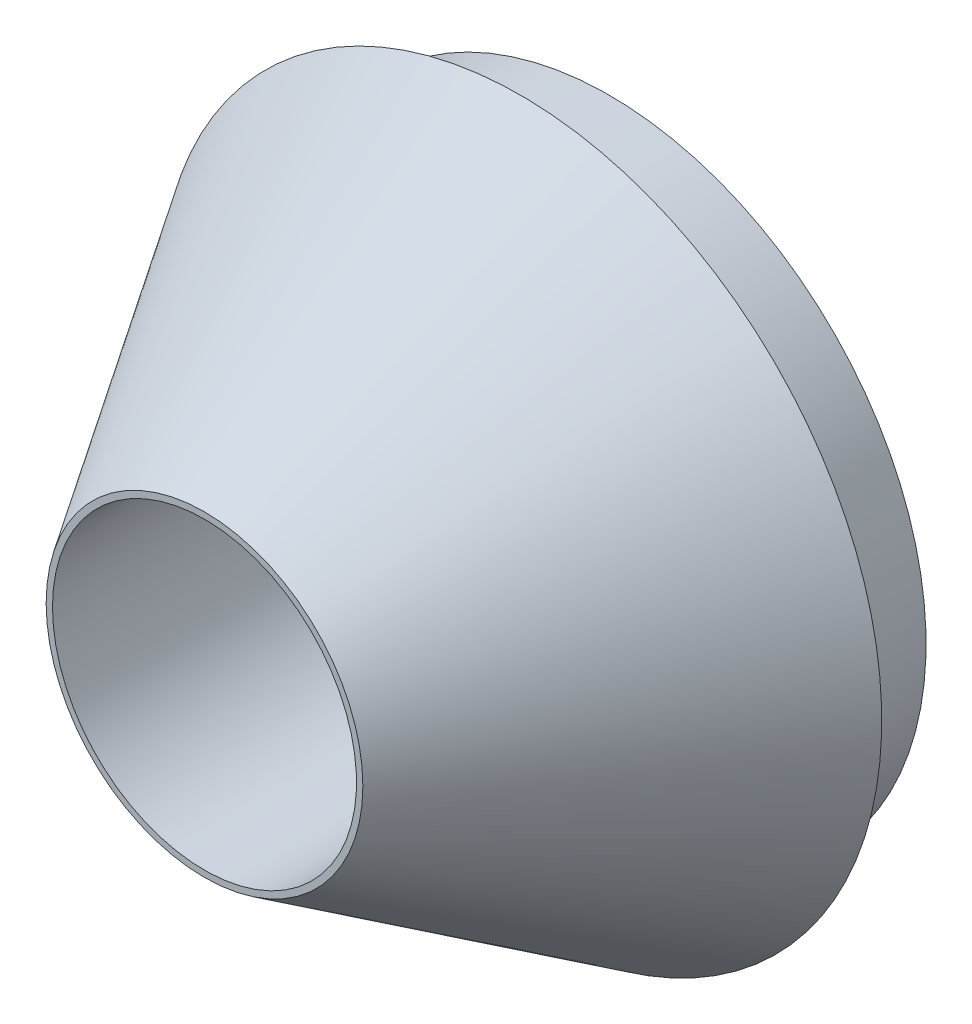
ISO-10303-21;
HEADER;
FILE_DESCRIPTION(('STEP AP214'),'2;1');
FILE_NAME('part.step','',(''),(''),'','','');
FILE_SCHEMA(('AUTOMOTIVE_DESIGN { 1 0 10303 214 1 1 1 1 }'));
ENDSEC;
DATA;
#1=APPLICATION_CONTEXT('core data for automotive mechanical design processes');
#2=APPLICATION_PROTOCOL_DEFINITION('international standard','automotive_design',2000,#1);
#3=PRODUCT_CONTEXT('',#1,'mechanical');
#4=PRODUCT('Part','Part','',(#3));
#5=PRODUCT_RELATED_PRODUCT_CATEGORY('part','',(#4));
#6=PRODUCT_DEFINITION_FORMATION('','',#4);
#7=PRODUCT_DEFINITION_CONTEXT('part definition',#1,'design');
#8=PRODUCT_DEFINITION('design','',#6,#7);
#9=PRODUCT_DEFINITION_SHAPE('','',#8);
#10=(LENGTH_UNIT() NAMED_UNIT(*) SI_UNIT(.MILLI.,.METRE.));
#11=(NAMED_UNIT(*) PLANE_ANGLE_UNIT() SI_UNIT($,.RADIAN.));
#12=(NAMED_UNIT(*) SI_UNIT($,.STERADIAN.) SOLID_ANGLE_UNIT());
#13=UNCERTAINTY_MEASURE_WITH_UNIT(LENGTH_MEASURE(1.E-05),#10,'distance_accuracy_value','');
#14=(GEOMETRIC_REPRESENTATION_CONTEXT(3) GLOBAL_UNCERTAINTY_ASSIGNED_CONTEXT((#13)) GLOBAL_UNIT_ASSIGNED_CONTEXT((#10,
#11,#12)) REPRESENTATION_CONTEXT('',''));
#15=CARTESIAN_POINT('',(0.,0.,0.));
#16=DIRECTION('',(0.,0.,1.));
#17=DIRECTION('',(1.,0.,0.));
#18=AXIS2_PLACEMENT_3D('',#15,#16,#17);
#19=CARTESIAN_POINT('',(0.,0.,0.));
#20=DIRECTION('',(0.,0.,-1.));
#21=DIRECTION('',(-1.,0.,0.));
#22=AXIS2_PLACEMENT_3D('',#19,#20,#21);
#23=PLANE('',#22);
#24=CARTESIAN_POINT('',(0.,0.,0.));
#25=DIRECTION('',(0.,0.,-1.));
#26=DIRECTION('',(-1.,0.,0.));
#27=AXIS2_PLACEMENT_3D('',#24,#25,#26);
#28=CIRCLE('',#27,6.096);
#29=CARTESIAN_POINT('',(-6.096,0.,0.));
#30=VERTEX_POINT('',#29);
#31=EDGE_CURVE('E66',#30,#30,#28,.T.);
#32=ORIENTED_EDGE('',*,*,#31,.T.);
#33=EDGE_LOOP('',(#32));
#34=FACE_BOUND('',#33,.T.);
#35=CARTESIAN_POINT('',(0.,0.,0.));
#36=DIRECTION('',(0.,0.,-1.));
#37=DIRECTION('',(-1.,0.,0.));
#38=AXIS2_PLACEMENT_3D('',#35,#36,#37);
#39=CIRCLE('',#38,6.35);
#40=CARTESIAN_POINT('',(-6.35,0.,0.));
#41=VERTEX_POINT('',#40);
#42=EDGE_CURVE('E12',#41,#41,#39,.T.);
#43=ORIENTED_EDGE('',*,*,#42,.F.);
#44=EDGE_LOOP('',(#43));
#45=FACE_BOUND('',#44,.T.);
#46=ADVANCED_FACE('F47',(#34,#45),#23,.F.);
#47=CARTESIAN_POINT('',(0.,0.,0.));
#48=DIRECTION('',(0.,0.,-1.));
#49=DIRECTION('',(-1.,0.,0.));
#50=AXIS2_PLACEMENT_3D('',#47,#48,#49);
#51=CONICAL_SURFACE('',#50,6.35,0.57007453909959);
#52=CARTESIAN_POINT('',(0.,0.,-12.6787290640394));
#53=DIRECTION('',(0.,0.,-1.));
#54=DIRECTION('',(-1.,0.,0.));
#55=AXIS2_PLACEMENT_3D('',#52,#53,#54);
#56=CIRCLE('',#55,14.478);
#57=CARTESIAN_POINT('',(-14.478,0.,-12.6787290640394));
#58=VERTEX_POINT('',#57);
#59=EDGE_CURVE('E53',#58,#58,#56,.T.);
#60=ORIENTED_EDGE('',*,*,#59,.F.);
#61=EDGE_LOOP('',(#60));
#62=FACE_BOUND('',#61,.T.);
#63=ORIENTED_EDGE('',*,*,#42,.T.);
#64=EDGE_LOOP('',(#63));
#65=FACE_BOUND('',#64,.T.);
#66=ADVANCED_FACE('F90',(#62,#65),#51,.T.);
#67=CARTESIAN_POINT('',(14.478,0.,-12.6787290640394));
#68=DIRECTION('',(0.,0.,1.));
#69=DIRECTION('',(1.,0.,0.));
#70=AXIS2_PLACEMENT_3D('',#67,#68,#69);
#71=PLANE('',#70);
#72=CARTESIAN_POINT('',(0.,0.,-12.6787290640394));
#73=DIRECTION('',(0.,0.,-1.));
#74=DIRECTION('',(-1.,0.,0.));
#75=AXIS2_PLACEMENT_3D('',#72,#73,#74);
#76=CIRCLE('',#75,12.7);
#77=CARTESIAN_POINT('',(-12.7,0.,-12.6787290640394));
#78=VERTEX_POINT('',#77);
#79=EDGE_CURVE('E57',#78,#78,#76,.T.);
#80=ORIENTED_EDGE('',*,*,#79,.F.);
#81=EDGE_LOOP('',(#80));
#82=FACE_BOUND('',#81,.T.);
#83=ORIENTED_EDGE('',*,*,#59,.T.);
#84=EDGE_LOOP('',(#83));
#85=FACE_BOUND('',#84,.T.);
#86=ADVANCED_FACE('F85',(#82,#85),#71,.F.);
#87=CARTESIAN_POINT('',(0.,0.,-16.2347290640394));
#88=DIRECTION('',(0.,0.,-1.));
#89=DIRECTION('',(-1.,0.,0.));
#90=AXIS2_PLACEMENT_3D('',#87,#88,#89);
#91=CYLINDRICAL_SURFACE('',#90,12.7);
#92=CARTESIAN_POINT('',(0.,0.,-16.2347290640394));
#93=DIRECTION('',(0.,0.,-1.));
#94=DIRECTION('',(-1.,0.,0.));
#95=AXIS2_PLACEMENT_3D('',#92,#93,#94);
#96=CIRCLE('',#95,12.7);
#97=CARTESIAN_POINT('',(-12.7,0.,-16.2347290640394));
#98=VERTEX_POINT('',#97);
#99=EDGE_CURVE('E61',#98,#98,#96,.T.);
#100=ORIENTED_EDGE('',*,*,#99,.F.);
#101=EDGE_LOOP('',(#100));
#102=FACE_BOUND('',#101,.T.);
#103=ORIENTED_EDGE('',*,*,#79,.T.);
#104=EDGE_LOOP('',(#103));
#105=FACE_BOUND('',#104,.T.);
#106=ADVANCED_FACE('F79',(#102,#105),#91,.T.);
#107=CARTESIAN_POINT('',(12.7,0.,-16.2347290640394));
#108=DIRECTION('',(0.,0.,1.));
#109=DIRECTION('',(1.,0.,0.));
#110=AXIS2_PLACEMENT_3D('',#107,#108,#109);
#111=PLANE('',#110);
#112=CARTESIAN_POINT('',(0.,0.,-16.2347290640394));
#113=DIRECTION('',(0.,0.,-1.));
#114=DIRECTION('',(-1.,0.,0.));
#115=AXIS2_PLACEMENT_3D('',#112,#113,#114);
#116=CIRCLE('',#115,6.096);
#117=CARTESIAN_POINT('',(-6.096,0.,-16.2347290640394));
#118=VERTEX_POINT('',#117);
#119=EDGE_CURVE('E69',#118,#118,#116,.T.);
#120=ORIENTED_EDGE('',*,*,#119,.F.);
#121=EDGE_LOOP('',(#120));
#122=FACE_BOUND('',#121,.T.);
#123=ORIENTED_EDGE('',*,*,#99,.T.);
#124=EDGE_LOOP('',(#123));
#125=FACE_BOUND('',#124,.T.);
#126=ADVANCED_FACE('F76',(#122,#125),#111,.F.);
#127=CARTESIAN_POINT('',(0.,0.,1.54527093596059));
#128=DIRECTION('',(0.,0.,-1.));
#129=DIRECTION('',(-1.,0.,0.));
#130=AXIS2_PLACEMENT_3D('',#127,#128,#129);
#131=CYLINDRICAL_SURFACE('',#130,6.096);
#132=ORIENTED_EDGE('',*,*,#119,.T.);
#133=EDGE_LOOP('',(#132));
#134=FACE_BOUND('',#133,.T.);
#135=ORIENTED_EDGE('',*,*,#31,.F.);
#136=EDGE_LOOP('',(#135));
#137=FACE_BOUND('',#136,.T.);
#138=ADVANCED_FACE('F73',(#134,#137),#131,.F.);
#139=CLOSED_SHELL('',(#46,#66,#86,#106,#126,#138));
#140=MANIFOLD_SOLID_BREP('B2',#139);
#141=ADVANCED_BREP_SHAPE_REPRESENTATION('',(#18,#140),#14);
#142=SHAPE_DEFINITION_REPRESENTATION(#9,#141);
ENDSEC;
END-ISO-10303-21;
